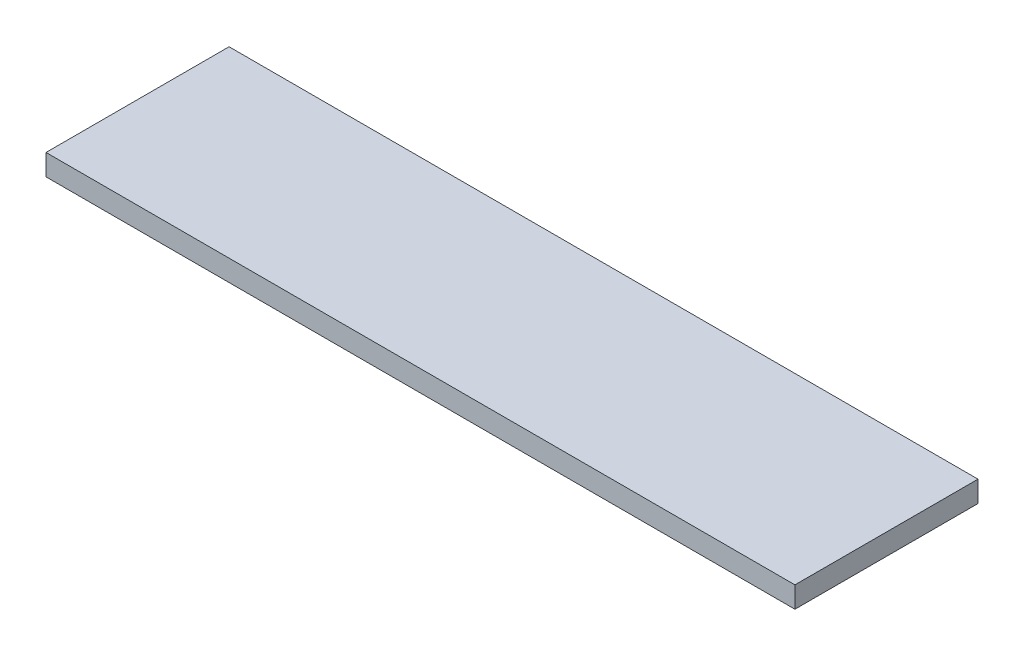
ISO-10303-21;
HEADER;
FILE_DESCRIPTION(('STEP AP214'),'2;1');
FILE_NAME('part.step','',(''),(''),'','','');
FILE_SCHEMA(('AUTOMOTIVE_DESIGN { 1 0 10303 214 1 1 1 1 }'));
ENDSEC;
DATA;
#1=APPLICATION_CONTEXT('core data for automotive mechanical design processes');
#2=APPLICATION_PROTOCOL_DEFINITION('international standard','automotive_design',2000,#1);
#3=PRODUCT_CONTEXT('',#1,'mechanical');
#4=PRODUCT('Part','Part','',(#3));
#5=PRODUCT_RELATED_PRODUCT_CATEGORY('part','',(#4));
#6=PRODUCT_DEFINITION_FORMATION('','',#4);
#7=PRODUCT_DEFINITION_CONTEXT('part definition',#1,'design');
#8=PRODUCT_DEFINITION('design','',#6,#7);
#9=PRODUCT_DEFINITION_SHAPE('','',#8);
#10=(LENGTH_UNIT() NAMED_UNIT(*) SI_UNIT(.MILLI.,.METRE.));
#11=(NAMED_UNIT(*) PLANE_ANGLE_UNIT() SI_UNIT($,.RADIAN.));
#12=(NAMED_UNIT(*) SI_UNIT($,.STERADIAN.) SOLID_ANGLE_UNIT());
#13=UNCERTAINTY_MEASURE_WITH_UNIT(LENGTH_MEASURE(1.E-05),#10,'distance_accuracy_value','');
#14=(GEOMETRIC_REPRESENTATION_CONTEXT(3) GLOBAL_UNCERTAINTY_ASSIGNED_CONTEXT((#13)) GLOBAL_UNIT_ASSIGNED_CONTEXT((#10,
#11,#12)) REPRESENTATION_CONTEXT('',''));
#15=CARTESIAN_POINT('',(0.,0.,0.));
#16=DIRECTION('',(0.,0.,1.));
#17=DIRECTION('',(1.,0.,0.));
#18=AXIS2_PLACEMENT_3D('',#15,#16,#17);
#19=CARTESIAN_POINT('',(45.,2.54,11.));
#20=DIRECTION('',(-1.,0.,0.));
#21=DIRECTION('',(0.,0.,1.));
#22=AXIS2_PLACEMENT_3D('',#19,#20,#21);
#23=PLANE('',#22);
#24=DIRECTION('',(0.,0.,-1.));
#25=VECTOR('',#24,1.);
#26=CARTESIAN_POINT('',(45.,0.,11.));
#27=LINE('',#26,#25);
#28=CARTESIAN_POINT('',(45.,0.,11.));
#29=VERTEX_POINT('',#28);
#30=CARTESIAN_POINT('',(45.,0.,-11.));
#31=VERTEX_POINT('',#30);
#32=EDGE_CURVE('E102',#29,#31,#27,.T.);
#33=ORIENTED_EDGE('',*,*,#32,.T.);
#34=DIRECTION('',(0.,-1.,0.));
#35=VECTOR('',#34,1.);
#36=CARTESIAN_POINT('',(45.,2.54,-11.));
#37=LINE('',#36,#35);
#38=CARTESIAN_POINT('',(45.,2.54,-11.));
#39=VERTEX_POINT('',#38);
#40=EDGE_CURVE('E11',#39,#31,#37,.T.);
#41=ORIENTED_EDGE('',*,*,#40,.F.);
#42=DIRECTION('',(0.,0.,-1.));
#43=VECTOR('',#42,1.);
#44=CARTESIAN_POINT('',(45.,2.54,11.));
#45=LINE('',#44,#43);
#46=CARTESIAN_POINT('',(45.,2.54,11.));
#47=VERTEX_POINT('',#46);
#48=EDGE_CURVE('E90',#47,#39,#45,.T.);
#49=ORIENTED_EDGE('',*,*,#48,.F.);
#50=DIRECTION('',(0.,-1.,0.));
#51=VECTOR('',#50,1.);
#52=CARTESIAN_POINT('',(45.,2.54,11.));
#53=LINE('',#52,#51);
#54=EDGE_CURVE('E98',#47,#29,#53,.T.);
#55=ORIENTED_EDGE('',*,*,#54,.T.);
#56=EDGE_LOOP('',(#33,#41,#49,#55));
#57=FACE_BOUND('',#56,.T.);
#58=ADVANCED_FACE('F39',(#57),#23,.F.);
#59=CARTESIAN_POINT('',(-45.,2.54,-11.));
#60=DIRECTION('',(0.,0.,1.));
#61=DIRECTION('',(1.,0.,0.));
#62=AXIS2_PLACEMENT_3D('',#59,#60,#61);
#63=PLANE('',#62);
#64=DIRECTION('',(-1.,0.,0.));
#65=VECTOR('',#64,1.);
#66=CARTESIAN_POINT('',(-45.,0.,-11.));
#67=LINE('',#66,#65);
#68=CARTESIAN_POINT('',(-45.,0.,-11.));
#69=VERTEX_POINT('',#68);
#70=EDGE_CURVE('E94',#31,#69,#67,.T.);
#71=ORIENTED_EDGE('',*,*,#70,.T.);
#72=DIRECTION('',(0.,-1.,0.));
#73=VECTOR('',#72,1.);
#74=CARTESIAN_POINT('',(-45.,2.54,-11.));
#75=LINE('',#74,#73);
#76=CARTESIAN_POINT('',(-45.,2.54,-11.));
#77=VERTEX_POINT('',#76);
#78=EDGE_CURVE('E47',#77,#69,#75,.T.);
#79=ORIENTED_EDGE('',*,*,#78,.F.);
#80=DIRECTION('',(-1.,0.,0.));
#81=VECTOR('',#80,1.);
#82=CARTESIAN_POINT('',(-45.,2.54,-11.));
#83=LINE('',#82,#81);
#84=EDGE_CURVE('E85',#39,#77,#83,.T.);
#85=ORIENTED_EDGE('',*,*,#84,.F.);
#86=ORIENTED_EDGE('',*,*,#40,.T.);
#87=EDGE_LOOP('',(#71,#79,#85,#86));
#88=FACE_BOUND('',#87,.T.);
#89=ADVANCED_FACE('F93',(#88),#63,.F.);
#90=CARTESIAN_POINT('',(-45.,2.54,11.));
#91=DIRECTION('',(1.,0.,0.));
#92=DIRECTION('',(0.,0.,-1.));
#93=AXIS2_PLACEMENT_3D('',#90,#91,#92);
#94=PLANE('',#93);
#95=DIRECTION('',(0.,0.,1.));
#96=VECTOR('',#95,1.);
#97=CARTESIAN_POINT('',(-45.,0.,11.));
#98=LINE('',#97,#96);
#99=CARTESIAN_POINT('',(-45.,0.,11.));
#100=VERTEX_POINT('',#99);
#101=EDGE_CURVE('E72',#69,#100,#98,.T.);
#102=ORIENTED_EDGE('',*,*,#101,.T.);
#103=DIRECTION('',(0.,-1.,0.));
#104=VECTOR('',#103,1.);
#105=CARTESIAN_POINT('',(-45.,2.54,11.));
#106=LINE('',#105,#104);
#107=CARTESIAN_POINT('',(-45.,2.54,11.));
#108=VERTEX_POINT('',#107);
#109=EDGE_CURVE('E95',#108,#100,#106,.T.);
#110=ORIENTED_EDGE('',*,*,#109,.F.);
#111=DIRECTION('',(0.,0.,1.));
#112=VECTOR('',#111,1.);
#113=CARTESIAN_POINT('',(-45.,2.54,11.));
#114=LINE('',#113,#112);
#115=EDGE_CURVE('E88',#77,#108,#114,.T.);
#116=ORIENTED_EDGE('',*,*,#115,.F.);
#117=ORIENTED_EDGE('',*,*,#78,.T.);
#118=EDGE_LOOP('',(#102,#110,#116,#117));
#119=FACE_BOUND('',#118,.T.);
#120=ADVANCED_FACE('F96',(#119),#94,.F.);
#121=CARTESIAN_POINT('',(-45.,2.54,11.));
#122=DIRECTION('',(0.,0.,-1.));
#123=DIRECTION('',(-1.,0.,0.));
#124=AXIS2_PLACEMENT_3D('',#121,#122,#123);
#125=PLANE('',#124);
#126=DIRECTION('',(1.,0.,0.));
#127=VECTOR('',#126,1.);
#128=CARTESIAN_POINT('',(-45.,0.,11.));
#129=LINE('',#128,#127);
#130=EDGE_CURVE('E78',#100,#29,#129,.T.);
#131=ORIENTED_EDGE('',*,*,#130,.T.);
#132=ORIENTED_EDGE('',*,*,#54,.F.);
#133=DIRECTION('',(1.,0.,0.));
#134=VECTOR('',#133,1.);
#135=CARTESIAN_POINT('',(-45.,2.54,11.));
#136=LINE('',#135,#134);
#137=EDGE_CURVE('E55',#108,#47,#136,.T.);
#138=ORIENTED_EDGE('',*,*,#137,.F.);
#139=ORIENTED_EDGE('',*,*,#109,.T.);
#140=EDGE_LOOP('',(#131,#132,#138,#139));
#141=FACE_BOUND('',#140,.T.);
#142=ADVANCED_FACE('F109',(#141),#125,.F.);
#143=CARTESIAN_POINT('',(0.,2.54,0.));
#144=DIRECTION('',(0.,-1.,0.));
#145=DIRECTION('',(0.,0.,-1.));
#146=AXIS2_PLACEMENT_3D('',#143,#144,#145);
#147=PLANE('',#146);
#148=ORIENTED_EDGE('',*,*,#48,.T.);
#149=ORIENTED_EDGE('',*,*,#84,.T.);
#150=ORIENTED_EDGE('',*,*,#115,.T.);
#151=ORIENTED_EDGE('',*,*,#137,.T.);
#152=EDGE_LOOP('',(#148,#149,#150,#151));
#153=FACE_BOUND('',#152,.T.);
#154=ADVANCED_FACE('F86',(#153),#147,.F.);
#155=CARTESIAN_POINT('',(0.,0.,0.));
#156=DIRECTION('',(0.,-1.,0.));
#157=DIRECTION('',(0.,0.,-1.));
#158=AXIS2_PLACEMENT_3D('',#155,#156,#157);
#159=PLANE('',#158);
#160=ORIENTED_EDGE('',*,*,#32,.F.);
#161=ORIENTED_EDGE('',*,*,#130,.F.);
#162=ORIENTED_EDGE('',*,*,#101,.F.);
#163=ORIENTED_EDGE('',*,*,#70,.F.);
#164=EDGE_LOOP('',(#160,#161,#162,#163));
#165=FACE_BOUND('',#164,.T.);
#166=ADVANCED_FACE('F112',(#165),#159,.T.);
#167=CLOSED_SHELL('',(#58,#89,#120,#142,#154,#166));
#168=MANIFOLD_SOLID_BREP('B2',#167);
#169=ADVANCED_BREP_SHAPE_REPRESENTATION('',(#18,#168),#14);
#170=SHAPE_DEFINITION_REPRESENTATION(#9,#169);
ENDSEC;
END-ISO-10303-21;
